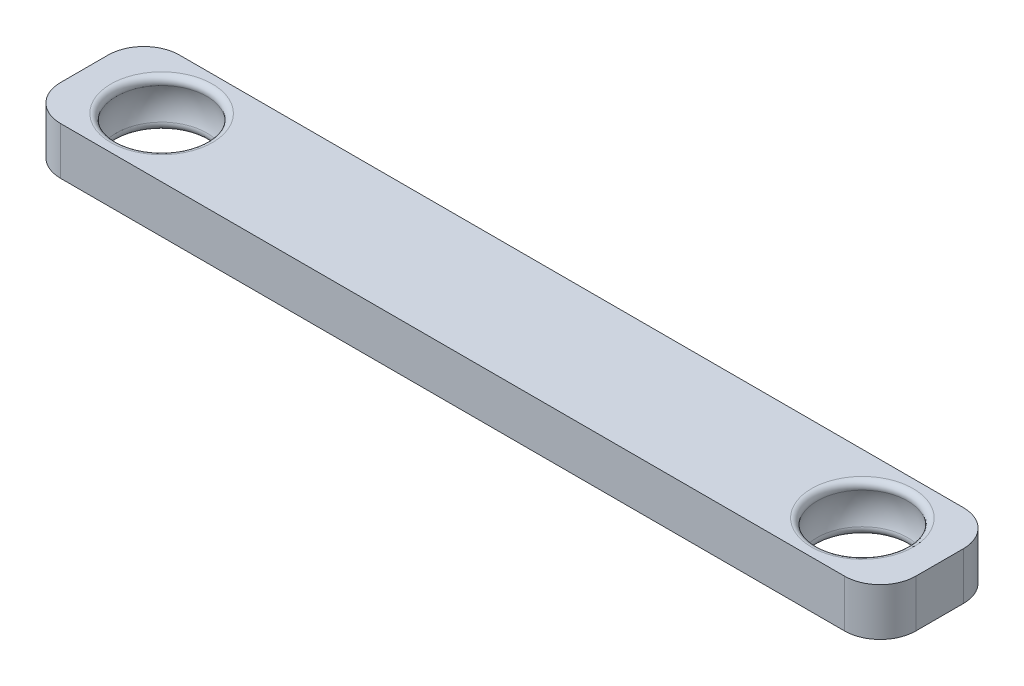
ISO-10303-21;
HEADER;
FILE_DESCRIPTION(('STEP AP214'),'2;1');
FILE_NAME('part.step','',(''),(''),'','','');
FILE_SCHEMA(('AUTOMOTIVE_DESIGN { 1 0 10303 214 1 1 1 1 }'));
ENDSEC;
DATA;
#1=APPLICATION_CONTEXT('core data for automotive mechanical design processes');
#2=APPLICATION_PROTOCOL_DEFINITION('international standard','automotive_design',2000,#1);
#3=PRODUCT_CONTEXT('',#1,'mechanical');
#4=PRODUCT('Part','Part','',(#3));
#5=PRODUCT_RELATED_PRODUCT_CATEGORY('part','',(#4));
#6=PRODUCT_DEFINITION_FORMATION('','',#4);
#7=PRODUCT_DEFINITION_CONTEXT('part definition',#1,'design');
#8=PRODUCT_DEFINITION('design','',#6,#7);
#9=PRODUCT_DEFINITION_SHAPE('','',#8);
#10=(LENGTH_UNIT() NAMED_UNIT(*) SI_UNIT(.MILLI.,.METRE.));
#11=(NAMED_UNIT(*) PLANE_ANGLE_UNIT() SI_UNIT($,.RADIAN.));
#12=(NAMED_UNIT(*) SI_UNIT($,.STERADIAN.) SOLID_ANGLE_UNIT());
#13=UNCERTAINTY_MEASURE_WITH_UNIT(LENGTH_MEASURE(1.E-05),#10,'distance_accuracy_value','');
#14=(GEOMETRIC_REPRESENTATION_CONTEXT(3) GLOBAL_UNCERTAINTY_ASSIGNED_CONTEXT((#13)) GLOBAL_UNIT_ASSIGNED_CONTEXT((#10,
#11,#12)) REPRESENTATION_CONTEXT('',''));
#15=CARTESIAN_POINT('',(0.,0.,0.));
#16=DIRECTION('',(0.,0.,1.));
#17=DIRECTION('',(1.,0.,0.));
#18=AXIS2_PLACEMENT_3D('',#15,#16,#17);
#19=CARTESIAN_POINT('',(36.,4.,-5.));
#20=DIRECTION('',(-1.,0.,0.));
#21=DIRECTION('',(0.,0.,1.));
#22=AXIS2_PLACEMENT_3D('',#19,#20,#21);
#23=PLANE('',#22);
#24=DIRECTION('',(0.,0.,-1.));
#25=VECTOR('',#24,1.);
#26=CARTESIAN_POINT('',(36.,0.,-5.));
#27=LINE('',#26,#25);
#28=CARTESIAN_POINT('',(36.,0.,2.));
#29=VERTEX_POINT('',#28);
#30=CARTESIAN_POINT('',(36.,0.,-2.));
#31=VERTEX_POINT('',#30);
#32=EDGE_CURVE('E138',#29,#31,#27,.T.);
#33=ORIENTED_EDGE('',*,*,#32,.T.);
#34=DIRECTION('',(0.,-1.,0.));
#35=VECTOR('',#34,1.);
#36=CARTESIAN_POINT('',(36.,4.,-2.));
#37=LINE('',#36,#35);
#38=CARTESIAN_POINT('',(36.,4.,-2.));
#39=VERTEX_POINT('',#38);
#40=EDGE_CURVE('E113',#31,#39,#37,.F.);
#41=ORIENTED_EDGE('',*,*,#40,.T.);
#42=DIRECTION('',(0.,0.,-1.));
#43=VECTOR('',#42,1.);
#44=CARTESIAN_POINT('',(36.,4.,-5.));
#45=LINE('',#44,#43);
#46=CARTESIAN_POINT('',(36.,4.,2.));
#47=VERTEX_POINT('',#46);
#48=EDGE_CURVE('E143',#47,#39,#45,.T.);
#49=ORIENTED_EDGE('',*,*,#48,.F.);
#50=DIRECTION('',(0.,-1.,0.));
#51=VECTOR('',#50,1.);
#52=CARTESIAN_POINT('',(36.,4.,2.));
#53=LINE('',#52,#51);
#54=EDGE_CURVE('E117',#47,#29,#53,.T.);
#55=ORIENTED_EDGE('',*,*,#54,.T.);
#56=EDGE_LOOP('',(#33,#41,#49,#55));
#57=FACE_BOUND('',#56,.T.);
#58=ADVANCED_FACE('F41',(#57),#23,.F.);
#59=CARTESIAN_POINT('',(-36.,4.,-5.));
#60=DIRECTION('',(0.,0.,1.));
#61=DIRECTION('',(1.,0.,0.));
#62=AXIS2_PLACEMENT_3D('',#59,#60,#61);
#63=PLANE('',#62);
#64=DIRECTION('',(-1.,0.,0.));
#65=VECTOR('',#64,1.);
#66=CARTESIAN_POINT('',(-36.,4.,-5.));
#67=LINE('',#66,#65);
#68=CARTESIAN_POINT('',(33.,4.,-5.));
#69=VERTEX_POINT('',#68);
#70=CARTESIAN_POINT('',(-33.,4.,-5.));
#71=VERTEX_POINT('',#70);
#72=EDGE_CURVE('E126',#69,#71,#67,.T.);
#73=ORIENTED_EDGE('',*,*,#72,.F.);
#74=DIRECTION('',(0.,-1.,0.));
#75=VECTOR('',#74,1.);
#76=CARTESIAN_POINT('',(33.,4.,-5.));
#77=LINE('',#76,#75);
#78=CARTESIAN_POINT('',(33.,0.,-5.));
#79=VERTEX_POINT('',#78);
#80=EDGE_CURVE('E115',#69,#79,#77,.T.);
#81=ORIENTED_EDGE('',*,*,#80,.T.);
#82=DIRECTION('',(-1.,0.,0.));
#83=VECTOR('',#82,1.);
#84=CARTESIAN_POINT('',(-36.,0.,-5.));
#85=LINE('',#84,#83);
#86=CARTESIAN_POINT('',(-33.,0.,-5.));
#87=VERTEX_POINT('',#86);
#88=EDGE_CURVE('E123',#79,#87,#85,.T.);
#89=ORIENTED_EDGE('',*,*,#88,.T.);
#90=DIRECTION('',(0.,-1.,0.));
#91=VECTOR('',#90,1.);
#92=CARTESIAN_POINT('',(-33.,4.,-5.));
#93=LINE('',#92,#91);
#94=EDGE_CURVE('E127',#87,#71,#93,.F.);
#95=ORIENTED_EDGE('',*,*,#94,.T.);
#96=EDGE_LOOP('',(#73,#81,#89,#95));
#97=FACE_BOUND('',#96,.T.);
#98=ADVANCED_FACE('F121',(#97),#63,.F.);
#99=CARTESIAN_POINT('',(-36.,4.,-5.));
#100=DIRECTION('',(1.,0.,0.));
#101=DIRECTION('',(0.,0.,-1.));
#102=AXIS2_PLACEMENT_3D('',#99,#100,#101);
#103=PLANE('',#102);
#104=DIRECTION('',(0.,0.,1.));
#105=VECTOR('',#104,1.);
#106=CARTESIAN_POINT('',(-36.,4.,-5.));
#107=LINE('',#106,#105);
#108=CARTESIAN_POINT('',(-36.,4.,-2.));
#109=VERTEX_POINT('',#108);
#110=CARTESIAN_POINT('',(-36.,4.,2.));
#111=VERTEX_POINT('',#110);
#112=EDGE_CURVE('E259',#109,#111,#107,.T.);
#113=ORIENTED_EDGE('',*,*,#112,.F.);
#114=DIRECTION('',(0.,-1.,0.));
#115=VECTOR('',#114,1.);
#116=CARTESIAN_POINT('',(-36.,4.,-2.));
#117=LINE('',#116,#115);
#118=CARTESIAN_POINT('',(-36.,0.,-2.));
#119=VERTEX_POINT('',#118);
#120=EDGE_CURVE('E170',#109,#119,#117,.T.);
#121=ORIENTED_EDGE('',*,*,#120,.T.);
#122=DIRECTION('',(0.,0.,1.));
#123=VECTOR('',#122,1.);
#124=CARTESIAN_POINT('',(-36.,0.,-5.));
#125=LINE('',#124,#123);
#126=CARTESIAN_POINT('',(-36.,0.,2.));
#127=VERTEX_POINT('',#126);
#128=EDGE_CURVE('E132',#119,#127,#125,.T.);
#129=ORIENTED_EDGE('',*,*,#128,.T.);
#130=DIRECTION('',(0.,-1.,0.));
#131=VECTOR('',#130,1.);
#132=CARTESIAN_POINT('',(-36.,4.,2.));
#133=LINE('',#132,#131);
#134=EDGE_CURVE('E164',#127,#111,#133,.F.);
#135=ORIENTED_EDGE('',*,*,#134,.T.);
#136=EDGE_LOOP('',(#113,#121,#129,#135));
#137=FACE_BOUND('',#136,.T.);
#138=ADVANCED_FACE('F216',(#137),#103,.F.);
#139=CARTESIAN_POINT('',(-36.,4.,5.));
#140=DIRECTION('',(0.,0.,-1.));
#141=DIRECTION('',(-1.,0.,0.));
#142=AXIS2_PLACEMENT_3D('',#139,#140,#141);
#143=PLANE('',#142);
#144=DIRECTION('',(1.,0.,0.));
#145=VECTOR('',#144,1.);
#146=CARTESIAN_POINT('',(-36.,0.,5.));
#147=LINE('',#146,#145);
#148=CARTESIAN_POINT('',(-33.,0.,5.));
#149=VERTEX_POINT('',#148);
#150=CARTESIAN_POINT('',(33.,0.,5.));
#151=VERTEX_POINT('',#150);
#152=EDGE_CURVE('E140',#149,#151,#147,.T.);
#153=ORIENTED_EDGE('',*,*,#152,.T.);
#154=DIRECTION('',(0.,-1.,0.));
#155=VECTOR('',#154,1.);
#156=CARTESIAN_POINT('',(33.,4.,5.));
#157=LINE('',#156,#155);
#158=CARTESIAN_POINT('',(33.,4.,5.));
#159=VERTEX_POINT('',#158);
#160=EDGE_CURVE('E57',#151,#159,#157,.F.);
#161=ORIENTED_EDGE('',*,*,#160,.T.);
#162=DIRECTION('',(1.,0.,0.));
#163=VECTOR('',#162,1.);
#164=CARTESIAN_POINT('',(-36.,4.,5.));
#165=LINE('',#164,#163);
#166=CARTESIAN_POINT('',(-33.,4.,5.));
#167=VERTEX_POINT('',#166);
#168=EDGE_CURVE('E148',#167,#159,#165,.T.);
#169=ORIENTED_EDGE('',*,*,#168,.F.);
#170=DIRECTION('',(0.,-1.,0.));
#171=VECTOR('',#170,1.);
#172=CARTESIAN_POINT('',(-33.,4.,5.));
#173=LINE('',#172,#171);
#174=EDGE_CURVE('E163',#167,#149,#173,.T.);
#175=ORIENTED_EDGE('',*,*,#174,.T.);
#176=EDGE_LOOP('',(#153,#161,#169,#175));
#177=FACE_BOUND('',#176,.T.);
#178=ADVANCED_FACE('F249',(#177),#143,.F.);
#179=CARTESIAN_POINT('',(0.,4.,0.));
#180=DIRECTION('',(0.,1.,0.));
#181=DIRECTION('',(0.,0.,1.));
#182=AXIS2_PLACEMENT_3D('',#179,#180,#181);
#183=PLANE('',#182);
#184=CARTESIAN_POINT('',(29.5,4.,0.));
#185=DIRECTION('',(0.,1.,0.));
#186=DIRECTION('',(0.,0.,1.));
#187=AXIS2_PLACEMENT_3D('',#184,#185,#186);
#188=CIRCLE('',#187,4.27564367951181);
#189=CARTESIAN_POINT('',(29.5,4.,4.27564367951181));
#190=VERTEX_POINT('',#189);
#191=EDGE_CURVE('E11',#190,#190,#188,.F.);
#192=ORIENTED_EDGE('',*,*,#191,.T.);
#193=EDGE_LOOP('',(#192));
#194=FACE_BOUND('',#193,.T.);
#195=CARTESIAN_POINT('',(-29.5,4.,0.));
#196=DIRECTION('',(0.,1.,0.));
#197=DIRECTION('',(0.,0.,1.));
#198=AXIS2_PLACEMENT_3D('',#195,#196,#197);
#199=CIRCLE('',#198,4.27564367951181);
#200=CARTESIAN_POINT('',(-29.5,4.,4.27564367951181));
#201=VERTEX_POINT('',#200);
#202=EDGE_CURVE('E47',#201,#201,#199,.F.);
#203=ORIENTED_EDGE('',*,*,#202,.T.);
#204=EDGE_LOOP('',(#203));
#205=FACE_BOUND('',#204,.T.);
#206=ORIENTED_EDGE('',*,*,#48,.T.);
#207=CARTESIAN_POINT('',(33.,4.,-2.));
#208=DIRECTION('',(0.,1.,0.));
#209=DIRECTION('',(0.,0.,1.));
#210=AXIS2_PLACEMENT_3D('',#207,#208,#209);
#211=CIRCLE('',#210,3.);
#212=EDGE_CURVE('E160',#39,#69,#211,.T.);
#213=ORIENTED_EDGE('',*,*,#212,.T.);
#214=ORIENTED_EDGE('',*,*,#72,.T.);
#215=CARTESIAN_POINT('',(-33.,4.,-2.));
#216=DIRECTION('',(0.,1.,0.));
#217=DIRECTION('',(0.,0.,1.));
#218=AXIS2_PLACEMENT_3D('',#215,#216,#217);
#219=CIRCLE('',#218,3.);
#220=EDGE_CURVE('E152',#71,#109,#219,.T.);
#221=ORIENTED_EDGE('',*,*,#220,.T.);
#222=ORIENTED_EDGE('',*,*,#112,.T.);
#223=CARTESIAN_POINT('',(-33.,4.,2.));
#224=DIRECTION('',(0.,1.,0.));
#225=DIRECTION('',(0.,0.,1.));
#226=AXIS2_PLACEMENT_3D('',#223,#224,#225);
#227=CIRCLE('',#226,3.);
#228=EDGE_CURVE('E61',#111,#167,#227,.T.);
#229=ORIENTED_EDGE('',*,*,#228,.T.);
#230=ORIENTED_EDGE('',*,*,#168,.T.);
#231=CARTESIAN_POINT('',(33.,4.,2.));
#232=DIRECTION('',(0.,1.,0.));
#233=DIRECTION('',(0.,0.,1.));
#234=AXIS2_PLACEMENT_3D('',#231,#232,#233);
#235=CIRCLE('',#234,3.);
#236=EDGE_CURVE('E159',#159,#47,#235,.T.);
#237=ORIENTED_EDGE('',*,*,#236,.T.);
#238=EDGE_LOOP('',(#206,#213,#214,#221,#222,#229,#230,#237));
#239=FACE_BOUND('',#238,.T.);
#240=ADVANCED_FACE('F188',(#194,#205,#239),#183,.T.);
#241=CARTESIAN_POINT('',(0.,0.,0.));
#242=DIRECTION('',(0.,1.,0.));
#243=DIRECTION('',(0.,0.,1.));
#244=AXIS2_PLACEMENT_3D('',#241,#242,#243);
#245=PLANE('',#244);
#246=CARTESIAN_POINT('',(-29.5,0.,0.));
#247=DIRECTION('',(0.,1.,0.));
#248=DIRECTION('',(0.,0.,1.));
#249=AXIS2_PLACEMENT_3D('',#246,#247,#248);
#250=CIRCLE('',#249,4.27564367951181);
#251=CARTESIAN_POINT('',(-29.5,0.,4.27564367951181));
#252=VERTEX_POINT('',#251);
#253=EDGE_CURVE('E173',#252,#252,#250,.T.);
#254=ORIENTED_EDGE('',*,*,#253,.T.);
#255=EDGE_LOOP('',(#254));
#256=FACE_BOUND('',#255,.T.);
#257=CARTESIAN_POINT('',(29.5,0.,0.));
#258=DIRECTION('',(0.,1.,0.));
#259=DIRECTION('',(0.,0.,1.));
#260=AXIS2_PLACEMENT_3D('',#257,#258,#259);
#261=CIRCLE('',#260,4.27564367951181);
#262=CARTESIAN_POINT('',(29.5,0.,4.27564367951181));
#263=VERTEX_POINT('',#262);
#264=EDGE_CURVE('E167',#263,#263,#261,.T.);
#265=ORIENTED_EDGE('',*,*,#264,.T.);
#266=EDGE_LOOP('',(#265));
#267=FACE_BOUND('',#266,.T.);
#268=ORIENTED_EDGE('',*,*,#88,.F.);
#269=CARTESIAN_POINT('',(33.,0.,-2.));
#270=DIRECTION('',(0.,1.,0.));
#271=DIRECTION('',(0.,0.,1.));
#272=AXIS2_PLACEMENT_3D('',#269,#270,#271);
#273=CIRCLE('',#272,3.);
#274=EDGE_CURVE('E108',#79,#31,#273,.F.);
#275=ORIENTED_EDGE('',*,*,#274,.T.);
#276=ORIENTED_EDGE('',*,*,#32,.F.);
#277=CARTESIAN_POINT('',(33.,0.,2.));
#278=DIRECTION('',(0.,1.,0.));
#279=DIRECTION('',(0.,0.,1.));
#280=AXIS2_PLACEMENT_3D('',#277,#278,#279);
#281=CIRCLE('',#280,3.);
#282=EDGE_CURVE('E118',#29,#151,#281,.F.);
#283=ORIENTED_EDGE('',*,*,#282,.T.);
#284=ORIENTED_EDGE('',*,*,#152,.F.);
#285=CARTESIAN_POINT('',(-33.,0.,2.));
#286=DIRECTION('',(0.,1.,0.));
#287=DIRECTION('',(0.,0.,1.));
#288=AXIS2_PLACEMENT_3D('',#285,#286,#287);
#289=CIRCLE('',#288,3.);
#290=EDGE_CURVE('E129',#149,#127,#289,.F.);
#291=ORIENTED_EDGE('',*,*,#290,.T.);
#292=ORIENTED_EDGE('',*,*,#128,.F.);
#293=CARTESIAN_POINT('',(-33.,0.,-2.));
#294=DIRECTION('',(0.,1.,0.));
#295=DIRECTION('',(0.,0.,1.));
#296=AXIS2_PLACEMENT_3D('',#293,#294,#295);
#297=CIRCLE('',#296,3.);
#298=EDGE_CURVE('E134',#119,#87,#297,.F.);
#299=ORIENTED_EDGE('',*,*,#298,.T.);
#300=EDGE_LOOP('',(#268,#275,#276,#283,#284,#291,#292,#299));
#301=FACE_BOUND('',#300,.T.);
#302=ADVANCED_FACE('F135',(#256,#267,#301),#245,.F.);
#303=CARTESIAN_POINT('',(-29.5,2.,0.));
#304=DIRECTION('',(0.,1.,0.));
#305=DIRECTION('',(-1.,0.,0.));
#306=AXIS2_PLACEMENT_3D('',#303,#304,#305);
#307=SPHERICAL_SURFACE('',#306,4.03112887414928);
#308=CARTESIAN_POINT('',(-29.5,0.665521665975747,0.));
#309=DIRECTION('',(0.,1.,0.));
#310=DIRECTION('',(0.,0.,1.));
#311=AXIS2_PLACEMENT_3D('',#308,#309,#310);
#312=CIRCLE('',#311,3.8038359028775);
#313=CARTESIAN_POINT('',(-33.3038359028775,0.665521665975747,0.));
#314=VERTEX_POINT('',#313);
#315=EDGE_CURVE('E177',#314,#314,#312,.F.);
#316=CARTESIAN_POINT('',(-29.5,3.33447833402425,0.));
#317=DIRECTION('',(0.,-1.,0.));
#318=DIRECTION('',(0.,0.,-1.));
#319=AXIS2_PLACEMENT_3D('',#316,#317,#318);
#320=CIRCLE('',#319,3.8038359028775);
#321=CARTESIAN_POINT('',(-33.3038359028775,3.33447833402425,0.));
#322=VERTEX_POINT('',#321);
#323=EDGE_CURVE('E176',#322,#322,#320,.F.);
#324=CARTESIAN_POINT('',(-33.3038359028775,0.665521665975747,0.));
#325=CARTESIAN_POINT('',(-33.313216470049,0.692260163696228,0.));
#326=CARTESIAN_POINT('',(-33.3223150164849,0.719097599316743,0.));
#327=CARTESIAN_POINT('',(-33.3399442210205,0.772958346828976,0.));
#328=CARTESIAN_POINT('',(-33.3484748791202,0.799981658720694,0.));
#329=CARTESIAN_POINT('',(-33.3649644601183,0.854202159246467,0.));
#330=CARTESIAN_POINT('',(-33.3729233830168,0.881399347880521,0.));
#331=CARTESIAN_POINT('',(-33.3882659686585,0.93595550289289,0.));
#332=CARTESIAN_POINT('',(-33.3956496314019,0.963314469271204,0.));
#333=CARTESIAN_POINT('',(-33.409838409461,1.0181820147676,0.));
#334=CARTESIAN_POINT('',(-33.4166435247767,1.04569059388568,0.));
#335=CARTESIAN_POINT('',(-33.4296721828406,1.10084513173569,0.));
#336=CARTESIAN_POINT('',(-33.4358957255888,1.12849109046761,0.));
#337=CARTESIAN_POINT('',(-33.4477584706951,1.18390809375409,0.));
#338=CARTESIAN_POINT('',(-33.4533976730534,1.21167913830865,0.));
#339=CARTESIAN_POINT('',(-33.4640892297568,1.26733396371065,0.));
#340=CARTESIAN_POINT('',(-33.469141584102,1.29521774455809,0.));
#341=CARTESIAN_POINT('',(-33.4786571980282,1.35108564291394,0.));
#342=CARTESIAN_POINT('',(-33.4831204576091,1.37906976042237,0.));
#343=CARTESIAN_POINT('',(-33.4914558972453,1.43512588784141,0.));
#344=CARTESIAN_POINT('',(-33.4953280773004,1.46319789775203,0.));
#345=CARTESIAN_POINT('',(-33.5024796359638,1.519417326634,0.));
#346=CARTESIAN_POINT('',(-33.505759014572,1.54756474560535,0.));
#347=CARTESIAN_POINT('',(-33.511723512035,1.60392247573308,0.));
#348=CARTESIAN_POINT('',(-33.5144086308897,1.63213278688946,0.));
#349=CARTESIAN_POINT('',(-33.5191834148003,1.68860375654416,0.));
#350=CARTESIAN_POINT('',(-33.521273079856,1.71686441504248,0.));
#351=CARTESIAN_POINT('',(-33.5248560269154,1.773423512149,0.));
#352=CARTESIAN_POINT('',(-33.526349308919,1.8017219507572,0.));
#353=CARTESIAN_POINT('',(-33.5287388258265,1.85834402405095,0.));
#354=CARTESIAN_POINT('',(-33.5296350607304,1.88666765873651,0.));
#355=CARTESIAN_POINT('',(-33.5308300848918,1.94332752894805,0.));
#356=CARTESIAN_POINT('',(-33.5311288741493,1.97166376447402,0.));
#357=CARTESIAN_POINT('',(-33.5311288741493,2.02833623552598,0.));
#358=CARTESIAN_POINT('',(-33.5308300848918,2.05667247105195,0.));
#359=CARTESIAN_POINT('',(-33.5296350607304,2.11333234126349,0.));
#360=CARTESIAN_POINT('',(-33.5287388258265,2.14165597594905,0.));
#361=CARTESIAN_POINT('',(-33.526349308919,2.1982780492428,0.));
#362=CARTESIAN_POINT('',(-33.5248560269154,2.226576487851,0.));
#363=CARTESIAN_POINT('',(-33.521273079856,2.28313558495752,0.));
#364=CARTESIAN_POINT('',(-33.5191834148003,2.31139624345584,0.));
#365=CARTESIAN_POINT('',(-33.5144086308897,2.36786721311054,0.));
#366=CARTESIAN_POINT('',(-33.511723512035,2.39607752426692,0.));
#367=CARTESIAN_POINT('',(-33.505759014572,2.45243525439465,0.));
#368=CARTESIAN_POINT('',(-33.5024796359638,2.480582673366,0.));
#369=CARTESIAN_POINT('',(-33.4953280773004,2.53680210224797,0.));
#370=CARTESIAN_POINT('',(-33.4914558972453,2.56487411215859,0.));
#371=CARTESIAN_POINT('',(-33.4831204576091,2.62093023957763,0.));
#372=CARTESIAN_POINT('',(-33.4786571980282,2.64891435708606,0.));
#373=CARTESIAN_POINT('',(-33.469141584102,2.70478225544191,0.));
#374=CARTESIAN_POINT('',(-33.4640892297568,2.73266603628935,0.));
#375=CARTESIAN_POINT('',(-33.4533976730534,2.78832086169135,0.));
#376=CARTESIAN_POINT('',(-33.4477584706951,2.81609190624591,0.));
#377=CARTESIAN_POINT('',(-33.4358957255888,2.87150890953239,0.));
#378=CARTESIAN_POINT('',(-33.4296721828406,2.89915486826431,0.));
#379=CARTESIAN_POINT('',(-33.4166435247767,2.95430940611432,0.));
#380=CARTESIAN_POINT('',(-33.409838409461,2.9818179852324,0.));
#381=CARTESIAN_POINT('',(-33.3956496314019,3.0366855307288,0.));
#382=CARTESIAN_POINT('',(-33.3882659686585,3.06404449710711,0.));
#383=CARTESIAN_POINT('',(-33.3729233830168,3.11860065211948,0.));
#384=CARTESIAN_POINT('',(-33.3649644601183,3.14579784075353,0.));
#385=CARTESIAN_POINT('',(-33.3484748791202,3.20001834127931,0.));
#386=CARTESIAN_POINT('',(-33.3399442210205,3.22704165317102,0.));
#387=CARTESIAN_POINT('',(-33.3223150164849,3.28090240068326,0.));
#388=CARTESIAN_POINT('',(-33.313216470049,3.30773983630377,0.));
#389=CARTESIAN_POINT('',(-33.3038359028775,3.33447833402425,0.));
#390=B_SPLINE_CURVE_WITH_KNOTS('',3,(#324,#325,#326,#327,#328,#329,#330,#331,#332,#333,#334,
#335,#336,#337,#338,#339,#340,#341,#342,#343,#344,#345,#346,#347,#348,#349,#350,#351,#352,#353,
#354,#355,#356,#357,#358,#359,#360,#361,#362,#363,#364,#365,#366,#367,#368,#369,#370,#371,#372,
#373,#374,#375,#376,#377,#378,#379,#380,#381,#382,#383,#384,#385,#386,#387,#388,#389),
.UNSPECIFIED.,.F.,.F.,(4,2,2,2,2,2,2,2,2,2,2,2,2,2,2,2,2,2,2,2,2,2,2,2,2,2,2,2,2,2,2,2,4),(0.,
0.0850071315166614,0.170014263033325,0.255021394549988,0.340028526066651,0.425035657583315,
0.510042789099977,0.59504992061664,0.680057052133302,0.765064183649966,0.850071315166629,
0.935078446683292,1.02008557819996,1.10509270971662,1.19009984123328,1.27510697274994,
1.36011410426661,1.44512123578327,1.53012836729993,1.6151354988166,1.70014263033326,
1.78514976184992,1.87015689336658,1.95516402488325,2.04017115639991,2.12517828791657,
2.21018541943324,2.2951925509499,2.38019968246656,2.46520681398323,2.55021394549989,
2.63522107701655,2.72022820853321),.UNSPECIFIED.);
#391=EDGE_CURVE('BSEAM200',#314,#322,#390,.T.);
#392=ORIENTED_EDGE('',*,*,#315,.T.);
#393=ORIENTED_EDGE('',*,*,#323,.T.);
#394=ORIENTED_EDGE('',*,*,#391,.T.);
#395=ORIENTED_EDGE('',*,*,#391,.F.);
#396=EDGE_LOOP('',(#392,#394,#393,#395));
#397=FACE_BOUND('',#396,.T.);
#398=ADVANCED_FACE('F200',(#397),#307,.F.);
#399=CARTESIAN_POINT('',(33.,4.,-2.));
#400=DIRECTION('',(0.,-1.,0.));
#401=DIRECTION('',(0.,0.,-1.));
#402=AXIS2_PLACEMENT_3D('',#399,#400,#401);
#403=CYLINDRICAL_SURFACE('',#402,3.);
#404=ORIENTED_EDGE('',*,*,#212,.F.);
#405=ORIENTED_EDGE('',*,*,#40,.F.);
#406=ORIENTED_EDGE('',*,*,#274,.F.);
#407=ORIENTED_EDGE('',*,*,#80,.F.);
#408=EDGE_LOOP('',(#404,#405,#406,#407));
#409=FACE_BOUND('',#408,.T.);
#410=ADVANCED_FACE('F111',(#409),#403,.T.);
#411=CARTESIAN_POINT('',(33.,4.,2.));
#412=DIRECTION('',(0.,-1.,0.));
#413=DIRECTION('',(0.,0.,-1.));
#414=AXIS2_PLACEMENT_3D('',#411,#412,#413);
#415=CYLINDRICAL_SURFACE('',#414,3.);
#416=ORIENTED_EDGE('',*,*,#236,.F.);
#417=ORIENTED_EDGE('',*,*,#160,.F.);
#418=ORIENTED_EDGE('',*,*,#282,.F.);
#419=ORIENTED_EDGE('',*,*,#54,.F.);
#420=EDGE_LOOP('',(#416,#417,#418,#419));
#421=FACE_BOUND('',#420,.T.);
#422=ADVANCED_FACE('F207',(#421),#415,.T.);
#423=CARTESIAN_POINT('',(-33.,4.,-2.));
#424=DIRECTION('',(0.,-1.,0.));
#425=DIRECTION('',(0.,0.,-1.));
#426=AXIS2_PLACEMENT_3D('',#423,#424,#425);
#427=CYLINDRICAL_SURFACE('',#426,3.);
#428=ORIENTED_EDGE('',*,*,#220,.F.);
#429=ORIENTED_EDGE('',*,*,#94,.F.);
#430=ORIENTED_EDGE('',*,*,#298,.F.);
#431=ORIENTED_EDGE('',*,*,#120,.F.);
#432=EDGE_LOOP('',(#428,#429,#430,#431));
#433=FACE_BOUND('',#432,.T.);
#434=ADVANCED_FACE('F225',(#433),#427,.T.);
#435=CARTESIAN_POINT('',(-33.,4.,2.));
#436=DIRECTION('',(0.,-1.,0.));
#437=DIRECTION('',(0.,0.,-1.));
#438=AXIS2_PLACEMENT_3D('',#435,#436,#437);
#439=CYLINDRICAL_SURFACE('',#438,3.);
#440=ORIENTED_EDGE('',*,*,#228,.F.);
#441=ORIENTED_EDGE('',*,*,#134,.F.);
#442=ORIENTED_EDGE('',*,*,#290,.F.);
#443=ORIENTED_EDGE('',*,*,#174,.F.);
#444=EDGE_LOOP('',(#440,#441,#442,#443));
#445=FACE_BOUND('',#444,.T.);
#446=ADVANCED_FACE('F226',(#445),#439,.T.);
#447=CARTESIAN_POINT('',(29.5,2.,0.));
#448=DIRECTION('',(0.,1.,0.));
#449=DIRECTION('',(1.,0.,0.));
#450=AXIS2_PLACEMENT_3D('',#447,#448,#449);
#451=SPHERICAL_SURFACE('',#450,4.03112887414928);
#452=CARTESIAN_POINT('',(29.5,0.665521665975747,0.));
#453=DIRECTION('',(0.,1.,0.));
#454=DIRECTION('',(0.,0.,1.));
#455=AXIS2_PLACEMENT_3D('',#452,#453,#454);
#456=CIRCLE('',#455,3.8038359028775);
#457=CARTESIAN_POINT('',(33.3038359028775,0.665521665975747,0.));
#458=VERTEX_POINT('',#457);
#459=EDGE_CURVE('E184',#458,#458,#456,.F.);
#460=CARTESIAN_POINT('',(29.5,3.33447833402425,0.));
#461=DIRECTION('',(0.,-1.,0.));
#462=DIRECTION('',(0.,0.,-1.));
#463=AXIS2_PLACEMENT_3D('',#460,#461,#462);
#464=CIRCLE('',#463,3.8038359028775);
#465=CARTESIAN_POINT('',(33.3038359028775,3.33447833402425,0.));
#466=VERTEX_POINT('',#465);
#467=EDGE_CURVE('E185',#466,#466,#464,.F.);
#468=CARTESIAN_POINT('',(33.3038359028775,0.665521665975747,0.));
#469=CARTESIAN_POINT('',(33.313216470049,0.692260163696228,0.));
#470=CARTESIAN_POINT('',(33.3223150164849,0.719097599316743,0.));
#471=CARTESIAN_POINT('',(33.3399442210205,0.772958346828976,0.));
#472=CARTESIAN_POINT('',(33.3484748791202,0.799981658720694,0.));
#473=CARTESIAN_POINT('',(33.3649644601183,0.854202159246467,0.));
#474=CARTESIAN_POINT('',(33.3729233830168,0.881399347880521,0.));
#475=CARTESIAN_POINT('',(33.3882659686585,0.93595550289289,0.));
#476=CARTESIAN_POINT('',(33.3956496314019,0.963314469271204,0.));
#477=CARTESIAN_POINT('',(33.409838409461,1.0181820147676,0.));
#478=CARTESIAN_POINT('',(33.4166435247767,1.04569059388568,0.));
#479=CARTESIAN_POINT('',(33.4296721828406,1.10084513173569,0.));
#480=CARTESIAN_POINT('',(33.4358957255888,1.12849109046761,0.));
#481=CARTESIAN_POINT('',(33.4477584706951,1.18390809375409,0.));
#482=CARTESIAN_POINT('',(33.4533976730534,1.21167913830865,0.));
#483=CARTESIAN_POINT('',(33.4640892297568,1.26733396371065,0.));
#484=CARTESIAN_POINT('',(33.469141584102,1.29521774455809,0.));
#485=CARTESIAN_POINT('',(33.4786571980282,1.35108564291394,0.));
#486=CARTESIAN_POINT('',(33.4831204576091,1.37906976042237,0.));
#487=CARTESIAN_POINT('',(33.4914558972453,1.43512588784141,0.));
#488=CARTESIAN_POINT('',(33.4953280773004,1.46319789775203,0.));
#489=CARTESIAN_POINT('',(33.5024796359638,1.519417326634,0.));
#490=CARTESIAN_POINT('',(33.505759014572,1.54756474560535,0.));
#491=CARTESIAN_POINT('',(33.511723512035,1.60392247573308,0.));
#492=CARTESIAN_POINT('',(33.5144086308897,1.63213278688946,0.));
#493=CARTESIAN_POINT('',(33.5191834148003,1.68860375654416,0.));
#494=CARTESIAN_POINT('',(33.521273079856,1.71686441504248,0.));
#495=CARTESIAN_POINT('',(33.5248560269154,1.773423512149,0.));
#496=CARTESIAN_POINT('',(33.526349308919,1.8017219507572,0.));
#497=CARTESIAN_POINT('',(33.5287388258265,1.85834402405095,0.));
#498=CARTESIAN_POINT('',(33.5296350607304,1.88666765873651,0.));
#499=CARTESIAN_POINT('',(33.5308300848918,1.94332752894805,0.));
#500=CARTESIAN_POINT('',(33.5311288741493,1.97166376447402,0.));
#501=CARTESIAN_POINT('',(33.5311288741493,2.02833623552598,0.));
#502=CARTESIAN_POINT('',(33.5308300848918,2.05667247105195,0.));
#503=CARTESIAN_POINT('',(33.5296350607304,2.11333234126349,0.));
#504=CARTESIAN_POINT('',(33.5287388258265,2.14165597594905,0.));
#505=CARTESIAN_POINT('',(33.526349308919,2.1982780492428,0.));
#506=CARTESIAN_POINT('',(33.5248560269154,2.226576487851,0.));
#507=CARTESIAN_POINT('',(33.521273079856,2.28313558495752,0.));
#508=CARTESIAN_POINT('',(33.5191834148003,2.31139624345584,0.));
#509=CARTESIAN_POINT('',(33.5144086308897,2.36786721311054,0.));
#510=CARTESIAN_POINT('',(33.511723512035,2.39607752426692,0.));
#511=CARTESIAN_POINT('',(33.505759014572,2.45243525439465,0.));
#512=CARTESIAN_POINT('',(33.5024796359638,2.480582673366,0.));
#513=CARTESIAN_POINT('',(33.4953280773004,2.53680210224797,0.));
#514=CARTESIAN_POINT('',(33.4914558972453,2.56487411215859,0.));
#515=CARTESIAN_POINT('',(33.4831204576091,2.62093023957763,0.));
#516=CARTESIAN_POINT('',(33.4786571980282,2.64891435708606,0.));
#517=CARTESIAN_POINT('',(33.469141584102,2.70478225544191,0.));
#518=CARTESIAN_POINT('',(33.4640892297568,2.73266603628935,0.));
#519=CARTESIAN_POINT('',(33.4533976730534,2.78832086169135,0.));
#520=CARTESIAN_POINT('',(33.4477584706951,2.81609190624591,0.));
#521=CARTESIAN_POINT('',(33.4358957255888,2.87150890953239,0.));
#522=CARTESIAN_POINT('',(33.4296721828406,2.89915486826431,0.));
#523=CARTESIAN_POINT('',(33.4166435247767,2.95430940611432,0.));
#524=CARTESIAN_POINT('',(33.409838409461,2.9818179852324,0.));
#525=CARTESIAN_POINT('',(33.3956496314019,3.0366855307288,0.));
#526=CARTESIAN_POINT('',(33.3882659686585,3.06404449710711,0.));
#527=CARTESIAN_POINT('',(33.3729233830168,3.11860065211948,0.));
#528=CARTESIAN_POINT('',(33.3649644601183,3.14579784075353,0.));
#529=CARTESIAN_POINT('',(33.3484748791202,3.20001834127931,0.));
#530=CARTESIAN_POINT('',(33.3399442210205,3.22704165317102,0.));
#531=CARTESIAN_POINT('',(33.3223150164849,3.28090240068326,0.));
#532=CARTESIAN_POINT('',(33.313216470049,3.30773983630377,0.));
#533=CARTESIAN_POINT('',(33.3038359028775,3.33447833402425,0.));
#534=B_SPLINE_CURVE_WITH_KNOTS('',3,(#468,#469,#470,#471,#472,#473,#474,#475,#476,#477,#478,
#479,#480,#481,#482,#483,#484,#485,#486,#487,#488,#489,#490,#491,#492,#493,#494,#495,#496,#497,
#498,#499,#500,#501,#502,#503,#504,#505,#506,#507,#508,#509,#510,#511,#512,#513,#514,#515,#516,
#517,#518,#519,#520,#521,#522,#523,#524,#525,#526,#527,#528,#529,#530,#531,#532,#533),
.UNSPECIFIED.,.F.,.F.,(4,2,2,2,2,2,2,2,2,2,2,2,2,2,2,2,2,2,2,2,2,2,2,2,2,2,2,2,2,2,2,2,4),(0.,
0.0850071315166614,0.170014263033325,0.255021394549988,0.340028526066651,0.425035657583315,
0.510042789099977,0.59504992061664,0.680057052133302,0.765064183649966,0.850071315166629,
0.935078446683292,1.02008557819996,1.10509270971662,1.19009984123328,1.27510697274994,
1.36011410426661,1.44512123578327,1.53012836729993,1.6151354988166,1.70014263033326,
1.78514976184992,1.87015689336658,1.95516402488325,2.04017115639991,2.12517828791657,
2.21018541943324,2.2951925509499,2.38019968246656,2.46520681398323,2.55021394549989,
2.63522107701655,2.72022820853321),.UNSPECIFIED.);
#535=EDGE_CURVE('BSEAM235',#458,#466,#534,.T.);
#536=ORIENTED_EDGE('',*,*,#459,.T.);
#537=ORIENTED_EDGE('',*,*,#467,.T.);
#538=ORIENTED_EDGE('',*,*,#535,.T.);
#539=ORIENTED_EDGE('',*,*,#535,.F.);
#540=EDGE_LOOP('',(#536,#538,#537,#539));
#541=FACE_BOUND('',#540,.T.);
#542=ADVANCED_FACE('F235',(#541),#451,.F.);
#543=CARTESIAN_POINT('',(-29.5,0.5,0.));
#544=DIRECTION('',(0.,1.,0.));
#545=DIRECTION('',(0.,0.,1.));
#546=AXIS2_PLACEMENT_3D('',#543,#544,#545);
#547=TOROIDAL_SURFACE('',#546,4.27564367951181,0.5);
#548=ORIENTED_EDGE('',*,*,#315,.F.);
#549=EDGE_LOOP('',(#548));
#550=FACE_BOUND('',#549,.T.);
#551=ORIENTED_EDGE('',*,*,#253,.F.);
#552=EDGE_LOOP('',(#551));
#553=FACE_BOUND('',#552,.T.);
#554=ADVANCED_FACE('F234',(#550,#553),#547,.T.);
#555=CARTESIAN_POINT('',(29.5,0.5,0.));
#556=DIRECTION('',(0.,1.,0.));
#557=DIRECTION('',(0.,0.,1.));
#558=AXIS2_PLACEMENT_3D('',#555,#556,#557);
#559=TOROIDAL_SURFACE('',#558,4.27564367951181,0.5);
#560=ORIENTED_EDGE('',*,*,#264,.F.);
#561=EDGE_LOOP('',(#560));
#562=FACE_BOUND('',#561,.T.);
#563=ORIENTED_EDGE('',*,*,#459,.F.);
#564=EDGE_LOOP('',(#563));
#565=FACE_BOUND('',#564,.T.);
#566=ADVANCED_FACE('F240',(#562,#565),#559,.T.);
#567=CARTESIAN_POINT('',(29.5,3.5,0.));
#568=DIRECTION('',(0.,1.,0.));
#569=DIRECTION('',(0.,0.,1.));
#570=AXIS2_PLACEMENT_3D('',#567,#568,#569);
#571=TOROIDAL_SURFACE('',#570,4.27564367951181,0.5);
#572=ORIENTED_EDGE('',*,*,#467,.F.);
#573=EDGE_LOOP('',(#572));
#574=FACE_BOUND('',#573,.T.);
#575=ORIENTED_EDGE('',*,*,#191,.F.);
#576=EDGE_LOOP('',(#575));
#577=FACE_BOUND('',#576,.T.);
#578=ADVANCED_FACE('F194',(#574,#577),#571,.T.);
#579=CARTESIAN_POINT('',(-29.5,3.5,0.));
#580=DIRECTION('',(0.,1.,0.));
#581=DIRECTION('',(0.,0.,1.));
#582=AXIS2_PLACEMENT_3D('',#579,#580,#581);
#583=TOROIDAL_SURFACE('',#582,4.27564367951181,0.5);
#584=ORIENTED_EDGE('',*,*,#202,.F.);
#585=EDGE_LOOP('',(#584));
#586=FACE_BOUND('',#585,.T.);
#587=ORIENTED_EDGE('',*,*,#323,.F.);
#588=EDGE_LOOP('',(#587));
#589=FACE_BOUND('',#588,.T.);
#590=ADVANCED_FACE('F43',(#586,#589),#583,.T.);
#591=CLOSED_SHELL('',(#58,#98,#138,#178,#240,#302,#398,#410,#422,#434,#446,#542,#554,#566,#578,#590));
#592=MANIFOLD_SOLID_BREP('B2',#591);
#593=ADVANCED_BREP_SHAPE_REPRESENTATION('',(#18,#592),#14);
#594=SHAPE_DEFINITION_REPRESENTATION(#9,#593);
ENDSEC;
END-ISO-10303-21;
